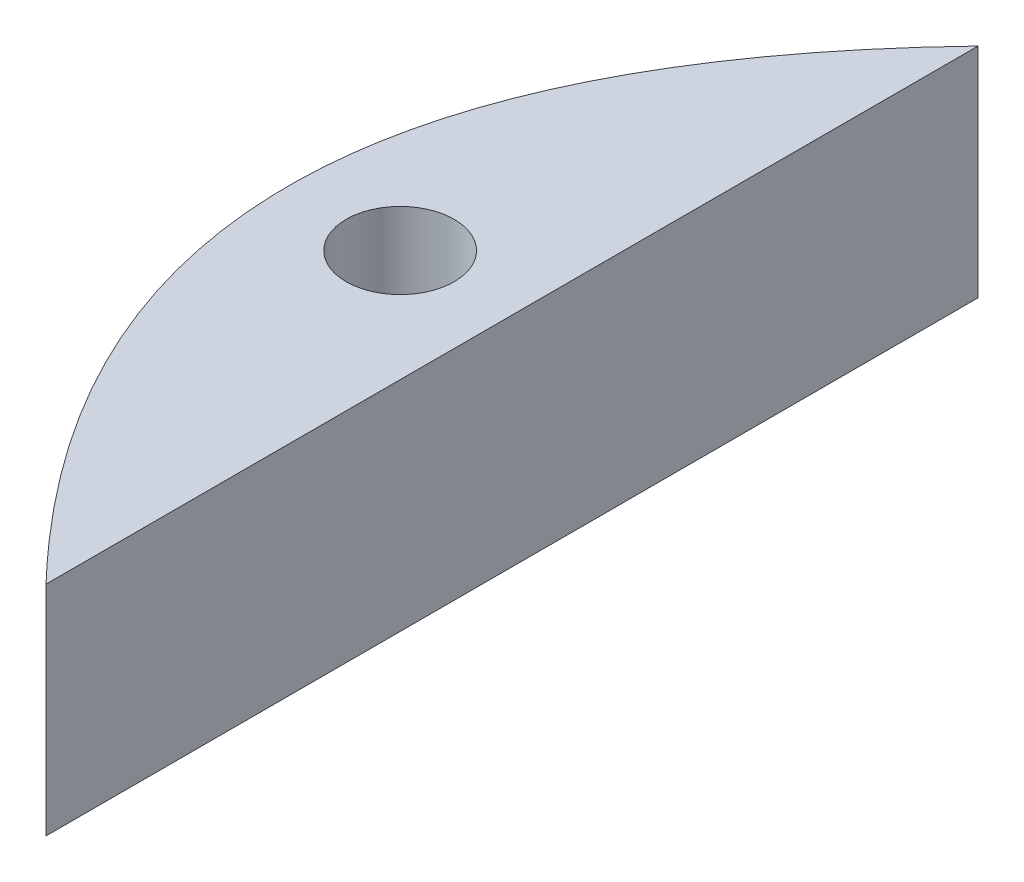
ISO-10303-21;
HEADER;
FILE_DESCRIPTION(('STEP AP214'),'2;1');
FILE_NAME('part.step','',(''),(''),'','','');
FILE_SCHEMA(('AUTOMOTIVE_DESIGN { 1 0 10303 214 1 1 1 1 }'));
ENDSEC;
DATA;
#1=APPLICATION_CONTEXT('core data for automotive mechanical design processes');
#2=APPLICATION_PROTOCOL_DEFINITION('international standard','automotive_design',2000,#1);
#3=PRODUCT_CONTEXT('',#1,'mechanical');
#4=PRODUCT('Part','Part','',(#3));
#5=PRODUCT_RELATED_PRODUCT_CATEGORY('part','',(#4));
#6=PRODUCT_DEFINITION_FORMATION('','',#4);
#7=PRODUCT_DEFINITION_CONTEXT('part definition',#1,'design');
#8=PRODUCT_DEFINITION('design','',#6,#7);
#9=PRODUCT_DEFINITION_SHAPE('','',#8);
#10=(LENGTH_UNIT() NAMED_UNIT(*) SI_UNIT(.MILLI.,.METRE.));
#11=(NAMED_UNIT(*) PLANE_ANGLE_UNIT() SI_UNIT($,.RADIAN.));
#12=(NAMED_UNIT(*) SI_UNIT($,.STERADIAN.) SOLID_ANGLE_UNIT());
#13=UNCERTAINTY_MEASURE_WITH_UNIT(LENGTH_MEASURE(1.E-05),#10,'distance_accuracy_value','');
#14=(GEOMETRIC_REPRESENTATION_CONTEXT(3) GLOBAL_UNCERTAINTY_ASSIGNED_CONTEXT((#13)) GLOBAL_UNIT_ASSIGNED_CONTEXT((#10,
#11,#12)) REPRESENTATION_CONTEXT('',''));
#15=CARTESIAN_POINT('',(0.,0.,0.));
#16=DIRECTION('',(0.,0.,1.));
#17=DIRECTION('',(1.,0.,0.));
#18=AXIS2_PLACEMENT_3D('',#15,#16,#17);
#19=CARTESIAN_POINT('',(-3.,5.85,0.));
#20=DIRECTION('',(0.,-1.,0.));
#21=DIRECTION('',(0.,0.,-1.));
#22=AXIS2_PLACEMENT_3D('',#19,#20,#21);
#23=PLANE('',#22);
#24=CARTESIAN_POINT('',(2.99999999999989,5.85,-12.5));
#25=CARTESIAN_POINT('',(-8.99999999999989,5.85,0.));
#26=CARTESIAN_POINT('',(2.99999999999989,5.85,12.5));
#27=B_SPLINE_CURVE_WITH_KNOTS('',2,(#24,#25,#26),.UNSPECIFIED.,.F.,.F.,(3,3),(0.,1.),.UNSPECIFIED.);
#28=CARTESIAN_POINT('',(2.99999999999989,5.85,-12.5));
#29=VERTEX_POINT('',#28);
#30=CARTESIAN_POINT('',(2.99999999999989,5.85,12.5));
#31=VERTEX_POINT('',#30);
#32=EDGE_CURVE('E67',#29,#31,#27,.T.);
#33=ORIENTED_EDGE('',*,*,#32,.T.);
#34=DIRECTION('',(0.,0.,-1.));
#35=VECTOR('',#34,1.);
#36=CARTESIAN_POINT('',(2.99999999999989,5.85,-12.5));
#37=LINE('',#36,#35);
#38=EDGE_CURVE('E52',#31,#29,#37,.T.);
#39=ORIENTED_EDGE('',*,*,#38,.T.);
#40=EDGE_LOOP('',(#33,#39));
#41=FACE_BOUND('',#40,.T.);
#42=CARTESIAN_POINT('',(0.,5.85,0.));
#43=DIRECTION('',(0.,1.,0.));
#44=DIRECTION('',(0.,0.,1.));
#45=AXIS2_PLACEMENT_3D('',#42,#43,#44);
#46=CIRCLE('',#45,1.45);
#47=CARTESIAN_POINT('',(0.,5.85,1.45));
#48=VERTEX_POINT('',#47);
#49=EDGE_CURVE('E73',#48,#48,#46,.T.);
#50=ORIENTED_EDGE('',*,*,#49,.F.);
#51=EDGE_LOOP('',(#50));
#52=FACE_BOUND('',#51,.T.);
#53=ADVANCED_FACE('F35',(#41,#52),#23,.F.);
#54=CARTESIAN_POINT('',(-3.,0.,0.));
#55=DIRECTION('',(0.,-1.,0.));
#56=DIRECTION('',(0.,0.,-1.));
#57=AXIS2_PLACEMENT_3D('',#54,#55,#56);
#58=PLANE('',#57);
#59=CARTESIAN_POINT('',(2.99999999999989,0.,-12.5));
#60=CARTESIAN_POINT('',(-8.99999999999989,0.,0.));
#61=CARTESIAN_POINT('',(2.99999999999989,0.,12.5));
#62=B_SPLINE_CURVE_WITH_KNOTS('',2,(#59,#60,#61),.UNSPECIFIED.,.F.,.F.,(3,3),(0.,1.),.UNSPECIFIED.);
#63=CARTESIAN_POINT('',(2.99999999999989,0.,-12.5));
#64=VERTEX_POINT('',#63);
#65=CARTESIAN_POINT('',(2.99999999999989,0.,12.5));
#66=VERTEX_POINT('',#65);
#67=EDGE_CURVE('E68',#64,#66,#62,.T.);
#68=ORIENTED_EDGE('',*,*,#67,.F.);
#69=DIRECTION('',(0.,0.,-1.));
#70=VECTOR('',#69,1.);
#71=CARTESIAN_POINT('',(2.99999999999989,0.,-12.5));
#72=LINE('',#71,#70);
#73=EDGE_CURVE('E60',#66,#64,#72,.T.);
#74=ORIENTED_EDGE('',*,*,#73,.F.);
#75=EDGE_LOOP('',(#68,#74));
#76=FACE_BOUND('',#75,.T.);
#77=CARTESIAN_POINT('',(0.,0.,0.));
#78=DIRECTION('',(0.,1.,0.));
#79=DIRECTION('',(0.,0.,1.));
#80=AXIS2_PLACEMENT_3D('',#77,#78,#79);
#81=CIRCLE('',#80,1.45);
#82=CARTESIAN_POINT('',(0.,0.,1.45));
#83=VERTEX_POINT('',#82);
#84=EDGE_CURVE('E76',#83,#83,#81,.T.);
#85=ORIENTED_EDGE('',*,*,#84,.T.);
#86=EDGE_LOOP('',(#85));
#87=FACE_BOUND('',#86,.T.);
#88=ADVANCED_FACE('F71',(#76,#87),#58,.T.);
#89=DIRECTION('',(0.,-1.,0.));
#90=VECTOR('',#89,1.);
#91=SURFACE_OF_LINEAR_EXTRUSION('',#27,#90);
#92=ORIENTED_EDGE('',*,*,#67,.T.);
#93=DIRECTION('',(0.,-1.,0.));
#94=VECTOR('',#93,1.);
#95=CARTESIAN_POINT('',(2.99999999999989,5.85,12.5));
#96=LINE('',#95,#94);
#97=EDGE_CURVE('E11',#31,#66,#96,.T.);
#98=ORIENTED_EDGE('',*,*,#97,.F.);
#99=ORIENTED_EDGE('',*,*,#32,.F.);
#100=DIRECTION('',(0.,-1.,0.));
#101=VECTOR('',#100,1.);
#102=CARTESIAN_POINT('',(2.99999999999989,5.85,-12.5));
#103=LINE('',#102,#101);
#104=EDGE_CURVE('E45',#29,#64,#103,.T.);
#105=ORIENTED_EDGE('',*,*,#104,.T.);
#106=EDGE_LOOP('',(#92,#98,#99,#105));
#107=FACE_BOUND('',#106,.T.);
#108=ADVANCED_FACE('F37',(#107),#91,.F.);
#109=CARTESIAN_POINT('',(2.99999999999989,5.85,-12.5));
#110=DIRECTION('',(-1.,0.,0.));
#111=DIRECTION('',(0.,0.,1.));
#112=AXIS2_PLACEMENT_3D('',#109,#110,#111);
#113=PLANE('',#112);
#114=ORIENTED_EDGE('',*,*,#73,.T.);
#115=ORIENTED_EDGE('',*,*,#104,.F.);
#116=ORIENTED_EDGE('',*,*,#38,.F.);
#117=ORIENTED_EDGE('',*,*,#97,.T.);
#118=EDGE_LOOP('',(#114,#115,#116,#117));
#119=FACE_BOUND('',#118,.T.);
#120=ADVANCED_FACE('F63',(#119),#113,.F.);
#121=CARTESIAN_POINT('',(0.,5.85,0.));
#122=DIRECTION('',(0.,-1.,0.));
#123=DIRECTION('',(0.,0.,-1.));
#124=AXIS2_PLACEMENT_3D('',#121,#122,#123);
#125=CYLINDRICAL_SURFACE('',#124,1.45);
#126=ORIENTED_EDGE('',*,*,#49,.T.);
#127=EDGE_LOOP('',(#126));
#128=FACE_BOUND('',#127,.T.);
#129=ORIENTED_EDGE('',*,*,#84,.F.);
#130=EDGE_LOOP('',(#129));
#131=FACE_BOUND('',#130,.T.);
#132=ADVANCED_FACE('F94',(#128,#131),#125,.F.);
#133=CLOSED_SHELL('',(#53,#88,#108,#120,#132));
#134=MANIFOLD_SOLID_BREP('B2',#133);
#135=ADVANCED_BREP_SHAPE_REPRESENTATION('',(#18,#134),#14);
#136=SHAPE_DEFINITION_REPRESENTATION(#9,#135);
ENDSEC;
END-ISO-10303-21;
